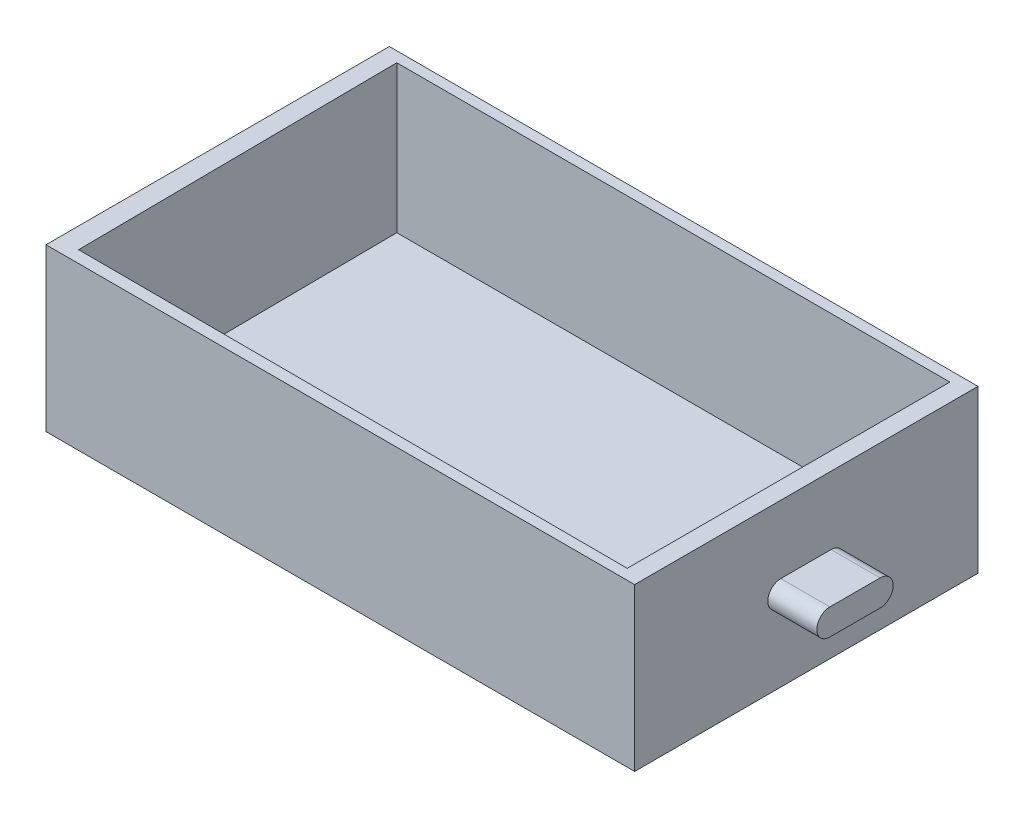
ISO-10303-21;
HEADER;
FILE_DESCRIPTION(('STEP AP214'),'2;1');
FILE_NAME('part.step','',(''),(''),'','','');
FILE_SCHEMA(('AUTOMOTIVE_DESIGN { 1 0 10303 214 1 1 1 1 }'));
ENDSEC;
DATA;
#1=APPLICATION_CONTEXT('core data for automotive mechanical design processes');
#2=APPLICATION_PROTOCOL_DEFINITION('international standard','automotive_design',2000,#1);
#3=PRODUCT_CONTEXT('',#1,'mechanical');
#4=PRODUCT('Part','Part','',(#3));
#5=PRODUCT_RELATED_PRODUCT_CATEGORY('part','',(#4));
#6=PRODUCT_DEFINITION_FORMATION('','',#4);
#7=PRODUCT_DEFINITION_CONTEXT('part definition',#1,'design');
#8=PRODUCT_DEFINITION('design','',#6,#7);
#9=PRODUCT_DEFINITION_SHAPE('','',#8);
#10=(LENGTH_UNIT() NAMED_UNIT(*) SI_UNIT(.MILLI.,.METRE.));
#11=(NAMED_UNIT(*) PLANE_ANGLE_UNIT() SI_UNIT($,.RADIAN.));
#12=(NAMED_UNIT(*) SI_UNIT($,.STERADIAN.) SOLID_ANGLE_UNIT());
#13=UNCERTAINTY_MEASURE_WITH_UNIT(LENGTH_MEASURE(1.E-05),#10,'distance_accuracy_value','');
#14=(GEOMETRIC_REPRESENTATION_CONTEXT(3) GLOBAL_UNCERTAINTY_ASSIGNED_CONTEXT((#13)) GLOBAL_UNIT_ASSIGNED_CONTEXT((#10,
#11,#12)) REPRESENTATION_CONTEXT('',''));
#15=CARTESIAN_POINT('',(0.,0.,0.));
#16=DIRECTION('',(0.,0.,1.));
#17=DIRECTION('',(1.,0.,0.));
#18=AXIS2_PLACEMENT_3D('',#15,#16,#17);
#19=CARTESIAN_POINT('',(60.,3.,-35.));
#20=DIRECTION('',(-1.,0.,0.));
#21=DIRECTION('',(0.,0.,1.));
#22=AXIS2_PLACEMENT_3D('',#19,#20,#21);
#23=PLANE('',#22);
#24=DIRECTION('',(0.,0.,-1.));
#25=VECTOR('',#24,1.);
#26=CARTESIAN_POINT('',(60.,0.,-35.));
#27=LINE('',#26,#25);
#28=CARTESIAN_POINT('',(60.,0.,35.));
#29=VERTEX_POINT('',#28);
#30=CARTESIAN_POINT('',(60.,0.,-35.));
#31=VERTEX_POINT('',#30);
#32=EDGE_CURVE('E222',#29,#31,#27,.T.);
#33=ORIENTED_EDGE('',*,*,#32,.T.);
#34=DIRECTION('',(0.,-1.,0.));
#35=VECTOR('',#34,1.);
#36=CARTESIAN_POINT('',(60.,3.,-35.));
#37=LINE('',#36,#35);
#38=CARTESIAN_POINT('',(60.,33.,-35.));
#39=VERTEX_POINT('',#38);
#40=EDGE_CURVE('E11',#39,#31,#37,.T.);
#41=ORIENTED_EDGE('',*,*,#40,.F.);
#42=DIRECTION('',(0.,0.,-1.));
#43=VECTOR('',#42,1.);
#44=CARTESIAN_POINT('',(60.,33.,-35.));
#45=LINE('',#44,#43);
#46=CARTESIAN_POINT('',(60.,33.,35.));
#47=VERTEX_POINT('',#46);
#48=EDGE_CURVE('E198',#47,#39,#45,.T.);
#49=ORIENTED_EDGE('',*,*,#48,.F.);
#50=DIRECTION('',(0.,-1.,0.));
#51=VECTOR('',#50,1.);
#52=CARTESIAN_POINT('',(60.,3.,35.));
#53=LINE('',#52,#51);
#54=EDGE_CURVE('E235',#47,#29,#53,.T.);
#55=ORIENTED_EDGE('',*,*,#54,.T.);
#56=EDGE_LOOP('',(#33,#41,#49,#55));
#57=FACE_BOUND('',#56,.T.);
#58=CARTESIAN_POINT('',(60.,16.5,5.19886684303352));
#59=DIRECTION('',(1.,0.,0.));
#60=DIRECTION('',(0.,0.,-1.));
#61=AXIS2_PLACEMENT_3D('',#58,#59,#60);
#62=CIRCLE('',#61,2.65988536155161);
#63=CARTESIAN_POINT('',(60.,19.1598853615516,5.19886684303352));
#64=VERTEX_POINT('',#63);
#65=CARTESIAN_POINT('',(60.,13.8401146384484,5.19886684303352));
#66=VERTEX_POINT('',#65);
#67=EDGE_CURVE('E58',#64,#66,#62,.T.);
#68=ORIENTED_EDGE('',*,*,#67,.F.);
#69=DIRECTION('',(0.,0.,1.));
#70=VECTOR('',#69,1.);
#71=CARTESIAN_POINT('',(60.,19.1598853615516,5.19886684303352));
#72=LINE('',#71,#70);
#73=CARTESIAN_POINT('',(60.,19.1598853615516,-5.03766166960611));
#74=VERTEX_POINT('',#73);
#75=EDGE_CURVE('E62',#74,#64,#72,.T.);
#76=ORIENTED_EDGE('',*,*,#75,.F.);
#77=CARTESIAN_POINT('',(60.,16.5,-5.03766166960611));
#78=DIRECTION('',(1.,0.,0.));
#79=DIRECTION('',(0.,0.,-1.));
#80=AXIS2_PLACEMENT_3D('',#77,#78,#79);
#81=CIRCLE('',#80,2.65988536155161);
#82=CARTESIAN_POINT('',(60.,13.8401146384484,-5.03766166960611));
#83=VERTEX_POINT('',#82);
#84=EDGE_CURVE('E451',#83,#74,#81,.T.);
#85=ORIENTED_EDGE('',*,*,#84,.F.);
#86=DIRECTION('',(0.,0.,-1.));
#87=VECTOR('',#86,1.);
#88=CARTESIAN_POINT('',(60.,13.8401146384484,5.19886684303352));
#89=LINE('',#88,#87);
#90=EDGE_CURVE('E461',#66,#83,#89,.T.);
#91=ORIENTED_EDGE('',*,*,#90,.F.);
#92=EDGE_LOOP('',(#68,#76,#85,#91));
#93=FACE_BOUND('',#92,.T.);
#94=ADVANCED_FACE('F43',(#57,#93),#23,.F.);
#95=CARTESIAN_POINT('',(-60.,3.,-35.));
#96=DIRECTION('',(0.,0.,1.));
#97=DIRECTION('',(1.,0.,0.));
#98=AXIS2_PLACEMENT_3D('',#95,#96,#97);
#99=PLANE('',#98);
#100=DIRECTION('',(-1.,0.,0.));
#101=VECTOR('',#100,1.);
#102=CARTESIAN_POINT('',(-60.,0.,-35.));
#103=LINE('',#102,#101);
#104=CARTESIAN_POINT('',(-60.,0.,-35.));
#105=VERTEX_POINT('',#104);
#106=EDGE_CURVE('E226',#31,#105,#103,.T.);
#107=ORIENTED_EDGE('',*,*,#106,.T.);
#108=DIRECTION('',(0.,-1.,0.));
#109=VECTOR('',#108,1.);
#110=CARTESIAN_POINT('',(-60.,3.,-35.));
#111=LINE('',#110,#109);
#112=CARTESIAN_POINT('',(-60.,33.,-35.));
#113=VERTEX_POINT('',#112);
#114=EDGE_CURVE('E51',#113,#105,#111,.T.);
#115=ORIENTED_EDGE('',*,*,#114,.F.);
#116=DIRECTION('',(-1.,0.,0.));
#117=VECTOR('',#116,1.);
#118=CARTESIAN_POINT('',(-60.,33.,-35.));
#119=LINE('',#118,#117);
#120=EDGE_CURVE('E202',#39,#113,#119,.T.);
#121=ORIENTED_EDGE('',*,*,#120,.F.);
#122=ORIENTED_EDGE('',*,*,#40,.T.);
#123=EDGE_LOOP('',(#107,#115,#121,#122));
#124=FACE_BOUND('',#123,.T.);
#125=ADVANCED_FACE('F262',(#124),#99,.F.);
#126=CARTESIAN_POINT('',(-60.,3.,-35.));
#127=DIRECTION('',(1.,0.,0.));
#128=DIRECTION('',(0.,0.,-1.));
#129=AXIS2_PLACEMENT_3D('',#126,#127,#128);
#130=PLANE('',#129);
#131=DIRECTION('',(0.,0.,1.));
#132=VECTOR('',#131,1.);
#133=CARTESIAN_POINT('',(-60.,0.,-35.));
#134=LINE('',#133,#132);
#135=CARTESIAN_POINT('',(-60.,0.,35.));
#136=VERTEX_POINT('',#135);
#137=EDGE_CURVE('E229',#105,#136,#134,.T.);
#138=ORIENTED_EDGE('',*,*,#137,.T.);
#139=DIRECTION('',(0.,-1.,0.));
#140=VECTOR('',#139,1.);
#141=CARTESIAN_POINT('',(-60.,3.,35.));
#142=LINE('',#141,#140);
#143=CARTESIAN_POINT('',(-60.,33.,35.));
#144=VERTEX_POINT('',#143);
#145=EDGE_CURVE('E239',#144,#136,#142,.T.);
#146=ORIENTED_EDGE('',*,*,#145,.F.);
#147=DIRECTION('',(0.,0.,1.));
#148=VECTOR('',#147,1.);
#149=CARTESIAN_POINT('',(-60.,33.,35.));
#150=LINE('',#149,#148);
#151=EDGE_CURVE('E190',#113,#144,#150,.T.);
#152=ORIENTED_EDGE('',*,*,#151,.F.);
#153=ORIENTED_EDGE('',*,*,#114,.T.);
#154=EDGE_LOOP('',(#138,#146,#152,#153));
#155=FACE_BOUND('',#154,.T.);
#156=ADVANCED_FACE('F247',(#155),#130,.F.);
#157=CARTESIAN_POINT('',(-60.,3.,35.));
#158=DIRECTION('',(0.,0.,-1.));
#159=DIRECTION('',(-1.,0.,0.));
#160=AXIS2_PLACEMENT_3D('',#157,#158,#159);
#161=PLANE('',#160);
#162=DIRECTION('',(1.,0.,0.));
#163=VECTOR('',#162,1.);
#164=CARTESIAN_POINT('',(-60.,0.,35.));
#165=LINE('',#164,#163);
#166=EDGE_CURVE('E232',#136,#29,#165,.T.);
#167=ORIENTED_EDGE('',*,*,#166,.T.);
#168=ORIENTED_EDGE('',*,*,#54,.F.);
#169=DIRECTION('',(1.,0.,0.));
#170=VECTOR('',#169,1.);
#171=CARTESIAN_POINT('',(60.,33.,35.));
#172=LINE('',#171,#170);
#173=EDGE_CURVE('E194',#144,#47,#172,.T.);
#174=ORIENTED_EDGE('',*,*,#173,.F.);
#175=ORIENTED_EDGE('',*,*,#145,.T.);
#176=EDGE_LOOP('',(#167,#168,#174,#175));
#177=FACE_BOUND('',#176,.T.);
#178=ADVANCED_FACE('F255',(#177),#161,.F.);
#179=CARTESIAN_POINT('',(0.,0.,0.));
#180=DIRECTION('',(0.,1.,0.));
#181=DIRECTION('',(0.,0.,1.));
#182=AXIS2_PLACEMENT_3D('',#179,#180,#181);
#183=PLANE('',#182);
#184=ORIENTED_EDGE('',*,*,#32,.F.);
#185=ORIENTED_EDGE('',*,*,#166,.F.);
#186=ORIENTED_EDGE('',*,*,#137,.F.);
#187=ORIENTED_EDGE('',*,*,#106,.F.);
#188=EDGE_LOOP('',(#184,#185,#186,#187));
#189=FACE_BOUND('',#188,.T.);
#190=ADVANCED_FACE('F253',(#189),#183,.F.);
#191=CARTESIAN_POINT('',(0.,33.,0.));
#192=DIRECTION('',(0.,-1.,0.));
#193=DIRECTION('',(0.,0.,-1.));
#194=AXIS2_PLACEMENT_3D('',#191,#192,#193);
#195=PLANE('',#194);
#196=ORIENTED_EDGE('',*,*,#151,.T.);
#197=ORIENTED_EDGE('',*,*,#173,.T.);
#198=ORIENTED_EDGE('',*,*,#48,.T.);
#199=ORIENTED_EDGE('',*,*,#120,.T.);
#200=EDGE_LOOP('',(#196,#197,#198,#199));
#201=FACE_BOUND('',#200,.T.);
#202=DIRECTION('',(0.00874329868267045,0.,0.99996177663356));
#203=VECTOR('',#202,1.);
#204=CARTESIAN_POINT('',(-55.8,33.,32.55));
#205=LINE('',#204,#203);
#206=CARTESIAN_POINT('',(-56.3721286162266,33.,-32.8837416927988));
#207=VERTEX_POINT('',#206);
#208=CARTESIAN_POINT('',(-55.8,33.,32.55));
#209=VERTEX_POINT('',#208);
#210=EDGE_CURVE('E155',#207,#209,#205,.T.);
#211=ORIENTED_EDGE('',*,*,#210,.F.);
#212=DIRECTION('',(-1.,0.,0.));
#213=VECTOR('',#212,1.);
#214=CARTESIAN_POINT('',(-56.3721286162266,33.,-32.8837416927988));
#215=LINE('',#214,#213);
#216=CARTESIAN_POINT('',(56.3721286162266,33.,-32.8837416927988));
#217=VERTEX_POINT('',#216);
#218=EDGE_CURVE('E171',#217,#207,#215,.T.);
#219=ORIENTED_EDGE('',*,*,#218,.F.);
#220=DIRECTION('',(0.,0.,-1.));
#221=VECTOR('',#220,1.);
#222=CARTESIAN_POINT('',(56.3721286162266,33.,-32.8837416927988));
#223=LINE('',#222,#221);
#224=CARTESIAN_POINT('',(56.3721286162266,33.,32.8837416927988));
#225=VERTEX_POINT('',#224);
#226=EDGE_CURVE('E167',#225,#217,#223,.T.);
#227=ORIENTED_EDGE('',*,*,#226,.F.);
#228=DIRECTION('',(0.999995573931537,0.,0.00297525080206931));
#229=VECTOR('',#228,1.);
#230=CARTESIAN_POINT('',(56.3721286162266,33.,32.8837416927988));
#231=LINE('',#230,#229);
#232=EDGE_CURVE('E159',#209,#225,#231,.T.);
#233=ORIENTED_EDGE('',*,*,#232,.F.);
#234=EDGE_LOOP('',(#211,#219,#227,#233));
#235=FACE_BOUND('',#234,.T.);
#236=ADVANCED_FACE('F260',(#201,#235),#195,.F.);
#237=CARTESIAN_POINT('',(-55.8,33.,32.55));
#238=DIRECTION('',(0.99996177663356,0.,-0.00874329868267045));
#239=DIRECTION('',(-0.00874329868267045,0.,-0.99996177663356));
#240=AXIS2_PLACEMENT_3D('',#237,#238,#239);
#241=PLANE('',#240);
#242=DIRECTION('',(0.,-1.,0.));
#243=VECTOR('',#242,1.);
#244=CARTESIAN_POINT('',(-55.8,33.,32.55));
#245=LINE('',#244,#243);
#246=CARTESIAN_POINT('',(-55.8,3.,32.55));
#247=VERTEX_POINT('',#246);
#248=EDGE_CURVE('E186',#209,#247,#245,.T.);
#249=ORIENTED_EDGE('',*,*,#248,.T.);
#250=DIRECTION('',(-0.00874329868267045,0.,-0.99996177663356));
#251=VECTOR('',#250,1.);
#252=CARTESIAN_POINT('',(-56.0803178477965,3.,0.490345711826204));
#253=LINE('',#252,#251);
#254=CARTESIAN_POINT('',(-56.3721286162266,3.,-32.8837416927988));
#255=VERTEX_POINT('',#254);
#256=EDGE_CURVE('E218',#247,#255,#253,.T.);
#257=ORIENTED_EDGE('',*,*,#256,.T.);
#258=DIRECTION('',(0.,-1.,0.));
#259=VECTOR('',#258,1.);
#260=CARTESIAN_POINT('',(-56.3721286162266,33.,-32.8837416927988));
#261=LINE('',#260,#259);
#262=EDGE_CURVE('E174',#207,#255,#261,.T.);
#263=ORIENTED_EDGE('',*,*,#262,.F.);
#264=ORIENTED_EDGE('',*,*,#210,.T.);
#265=EDGE_LOOP('',(#249,#257,#263,#264));
#266=FACE_BOUND('',#265,.T.);
#267=ADVANCED_FACE('F281',(#266),#241,.T.);
#268=CARTESIAN_POINT('',(56.3721286162266,33.,32.8837416927988));
#269=DIRECTION('',(0.00297525080206931,0.,-0.999995573931537));
#270=DIRECTION('',(-0.999995573931537,0.,-0.00297525080206931));
#271=AXIS2_PLACEMENT_3D('',#268,#269,#270);
#272=PLANE('',#271);
#273=DIRECTION('',(0.,-1.,0.));
#274=VECTOR('',#273,1.);
#275=CARTESIAN_POINT('',(56.3721286162266,33.,32.8837416927988));
#276=LINE('',#275,#274);
#277=CARTESIAN_POINT('',(56.3721286162266,3.,32.8837416927988));
#278=VERTEX_POINT('',#277);
#279=EDGE_CURVE('E182',#225,#278,#276,.T.);
#280=ORIENTED_EDGE('',*,*,#279,.T.);
#281=DIRECTION('',(-0.999995573931537,0.,-0.00297525080206931));
#282=VECTOR('',#281,1.);
#283=CARTESIAN_POINT('',(-0.0973379331146561,3.,32.7157301235248));
#284=LINE('',#283,#282);
#285=EDGE_CURVE('E214',#278,#247,#284,.T.);
#286=ORIENTED_EDGE('',*,*,#285,.T.);
#287=ORIENTED_EDGE('',*,*,#248,.F.);
#288=ORIENTED_EDGE('',*,*,#232,.T.);
#289=EDGE_LOOP('',(#280,#286,#287,#288));
#290=FACE_BOUND('',#289,.T.);
#291=ADVANCED_FACE('F284',(#290),#272,.T.);
#292=CARTESIAN_POINT('',(56.3721286162266,33.,-32.8837416927988));
#293=DIRECTION('',(-1.,0.,0.));
#294=DIRECTION('',(0.,0.,1.));
#295=AXIS2_PLACEMENT_3D('',#292,#293,#294);
#296=PLANE('',#295);
#297=DIRECTION('',(0.,-1.,0.));
#298=VECTOR('',#297,1.);
#299=CARTESIAN_POINT('',(56.3721286162266,33.,-32.8837416927988));
#300=LINE('',#299,#298);
#301=CARTESIAN_POINT('',(56.3721286162266,3.,-32.8837416927988));
#302=VERTEX_POINT('',#301);
#303=EDGE_CURVE('E178',#217,#302,#300,.T.);
#304=ORIENTED_EDGE('',*,*,#303,.T.);
#305=DIRECTION('',(0.,0.,1.));
#306=VECTOR('',#305,1.);
#307=CARTESIAN_POINT('',(56.3721286162266,3.,0.));
#308=LINE('',#307,#306);
#309=EDGE_CURVE('E210',#302,#278,#308,.T.);
#310=ORIENTED_EDGE('',*,*,#309,.T.);
#311=ORIENTED_EDGE('',*,*,#279,.F.);
#312=ORIENTED_EDGE('',*,*,#226,.T.);
#313=EDGE_LOOP('',(#304,#310,#311,#312));
#314=FACE_BOUND('',#313,.T.);
#315=ADVANCED_FACE('F288',(#314),#296,.T.);
#316=CARTESIAN_POINT('',(-56.3721286162266,33.,-32.8837416927988));
#317=DIRECTION('',(0.,0.,1.));
#318=DIRECTION('',(1.,0.,0.));
#319=AXIS2_PLACEMENT_3D('',#316,#317,#318);
#320=PLANE('',#319);
#321=ORIENTED_EDGE('',*,*,#262,.T.);
#322=DIRECTION('',(1.,0.,0.));
#323=VECTOR('',#322,1.);
#324=CARTESIAN_POINT('',(0.,3.,-32.8837416927988));
#325=LINE('',#324,#323);
#326=EDGE_CURVE('E206',#255,#302,#325,.T.);
#327=ORIENTED_EDGE('',*,*,#326,.T.);
#328=ORIENTED_EDGE('',*,*,#303,.F.);
#329=ORIENTED_EDGE('',*,*,#218,.T.);
#330=EDGE_LOOP('',(#321,#327,#328,#329));
#331=FACE_BOUND('',#330,.T.);
#332=ADVANCED_FACE('F277',(#331),#320,.T.);
#333=CARTESIAN_POINT('',(0.,3.,0.));
#334=DIRECTION('',(0.,1.,0.));
#335=DIRECTION('',(0.,0.,1.));
#336=AXIS2_PLACEMENT_3D('',#333,#334,#335);
#337=PLANE('',#336);
#338=ORIENTED_EDGE('',*,*,#256,.F.);
#339=ORIENTED_EDGE('',*,*,#285,.F.);
#340=ORIENTED_EDGE('',*,*,#309,.F.);
#341=ORIENTED_EDGE('',*,*,#326,.F.);
#342=EDGE_LOOP('',(#338,#339,#340,#341));
#343=FACE_BOUND('',#342,.T.);
#344=ADVANCED_FACE('F274',(#343),#337,.T.);
#345=CARTESIAN_POINT('',(70.,16.5,5.19886684303352));
#346=DIRECTION('',(-1.,0.,0.));
#347=DIRECTION('',(0.,0.,1.));
#348=AXIS2_PLACEMENT_3D('',#345,#346,#347);
#349=CYLINDRICAL_SURFACE('',#348,2.65988536155161);
#350=ORIENTED_EDGE('',*,*,#67,.T.);
#351=DIRECTION('',(-1.,0.,0.));
#352=VECTOR('',#351,1.);
#353=CARTESIAN_POINT('',(70.,13.8401146384484,5.19886684303352));
#354=LINE('',#353,#352);
#355=CARTESIAN_POINT('',(70.,13.8401146384484,5.19886684303352));
#356=VERTEX_POINT('',#355);
#357=EDGE_CURVE('E135',#356,#66,#354,.T.);
#358=ORIENTED_EDGE('',*,*,#357,.F.);
#359=CARTESIAN_POINT('',(70.,16.5,5.19886684303352));
#360=DIRECTION('',(1.,0.,0.));
#361=DIRECTION('',(0.,0.,-1.));
#362=AXIS2_PLACEMENT_3D('',#359,#360,#361);
#363=CIRCLE('',#362,2.65988536155161);
#364=CARTESIAN_POINT('',(70.,19.1598853615516,5.19886684303352));
#365=VERTEX_POINT('',#364);
#366=EDGE_CURVE('E142',#365,#356,#363,.T.);
#367=ORIENTED_EDGE('',*,*,#366,.F.);
#368=DIRECTION('',(-1.,0.,0.));
#369=VECTOR('',#368,1.);
#370=CARTESIAN_POINT('',(70.,19.1598853615516,5.19886684303352));
#371=LINE('',#370,#369);
#372=EDGE_CURVE('E448',#365,#64,#371,.T.);
#373=ORIENTED_EDGE('',*,*,#372,.T.);
#374=EDGE_LOOP('',(#350,#358,#367,#373));
#375=FACE_BOUND('',#374,.T.);
#376=ADVANCED_FACE('F153',(#375),#349,.T.);
#377=CARTESIAN_POINT('',(70.,13.8401146384484,5.19886684303352));
#378=DIRECTION('',(0.,1.,0.));
#379=DIRECTION('',(0.,0.,1.));
#380=AXIS2_PLACEMENT_3D('',#377,#378,#379);
#381=PLANE('',#380);
#382=ORIENTED_EDGE('',*,*,#90,.T.);
#383=DIRECTION('',(-1.,0.,0.));
#384=VECTOR('',#383,1.);
#385=CARTESIAN_POINT('',(70.,13.8401146384484,-5.03766166960611));
#386=LINE('',#385,#384);
#387=CARTESIAN_POINT('',(70.,13.8401146384484,-5.03766166960611));
#388=VERTEX_POINT('',#387);
#389=EDGE_CURVE('E137',#388,#83,#386,.T.);
#390=ORIENTED_EDGE('',*,*,#389,.F.);
#391=DIRECTION('',(0.,0.,-1.));
#392=VECTOR('',#391,1.);
#393=CARTESIAN_POINT('',(70.,13.8401146384484,5.19886684303352));
#394=LINE('',#393,#392);
#395=EDGE_CURVE('E130',#356,#388,#394,.T.);
#396=ORIENTED_EDGE('',*,*,#395,.F.);
#397=ORIENTED_EDGE('',*,*,#357,.T.);
#398=EDGE_LOOP('',(#382,#390,#396,#397));
#399=FACE_BOUND('',#398,.T.);
#400=ADVANCED_FACE('F133',(#399),#381,.F.);
#401=CARTESIAN_POINT('',(70.,16.5,-5.03766166960611));
#402=DIRECTION('',(-1.,0.,0.));
#403=DIRECTION('',(0.,0.,1.));
#404=AXIS2_PLACEMENT_3D('',#401,#402,#403);
#405=CYLINDRICAL_SURFACE('',#404,2.65988536155161);
#406=ORIENTED_EDGE('',*,*,#84,.T.);
#407=DIRECTION('',(-1.,0.,0.));
#408=VECTOR('',#407,1.);
#409=CARTESIAN_POINT('',(70.,19.1598853615516,-5.03766166960611));
#410=LINE('',#409,#408);
#411=CARTESIAN_POINT('',(70.,19.1598853615516,-5.03766166960611));
#412=VERTEX_POINT('',#411);
#413=EDGE_CURVE('E161',#412,#74,#410,.T.);
#414=ORIENTED_EDGE('',*,*,#413,.F.);
#415=CARTESIAN_POINT('',(70.,16.5,-5.03766166960611));
#416=DIRECTION('',(1.,0.,0.));
#417=DIRECTION('',(0.,0.,-1.));
#418=AXIS2_PLACEMENT_3D('',#415,#416,#417);
#419=CIRCLE('',#418,2.65988536155161);
#420=EDGE_CURVE('E141',#388,#412,#419,.T.);
#421=ORIENTED_EDGE('',*,*,#420,.F.);
#422=ORIENTED_EDGE('',*,*,#389,.T.);
#423=EDGE_LOOP('',(#406,#414,#421,#422));
#424=FACE_BOUND('',#423,.T.);
#425=ADVANCED_FACE('F300',(#424),#405,.T.);
#426=CARTESIAN_POINT('',(70.,19.1598853615516,5.19886684303352));
#427=DIRECTION('',(0.,-1.,0.));
#428=DIRECTION('',(0.,0.,-1.));
#429=AXIS2_PLACEMENT_3D('',#426,#427,#428);
#430=PLANE('',#429);
#431=ORIENTED_EDGE('',*,*,#75,.T.);
#432=ORIENTED_EDGE('',*,*,#372,.F.);
#433=DIRECTION('',(0.,0.,1.));
#434=VECTOR('',#433,1.);
#435=CARTESIAN_POINT('',(70.,19.1598853615516,5.19886684303352));
#436=LINE('',#435,#434);
#437=EDGE_CURVE('E147',#412,#365,#436,.T.);
#438=ORIENTED_EDGE('',*,*,#437,.F.);
#439=ORIENTED_EDGE('',*,*,#413,.T.);
#440=EDGE_LOOP('',(#431,#432,#438,#439));
#441=FACE_BOUND('',#440,.T.);
#442=ADVANCED_FACE('F303',(#441),#430,.F.);
#443=CARTESIAN_POINT('',(70.,16.5,5.19886684303352));
#444=DIRECTION('',(1.,0.,0.));
#445=DIRECTION('',(0.,0.,-1.));
#446=AXIS2_PLACEMENT_3D('',#443,#444,#445);
#447=PLANE('',#446);
#448=ORIENTED_EDGE('',*,*,#366,.T.);
#449=ORIENTED_EDGE('',*,*,#395,.T.);
#450=ORIENTED_EDGE('',*,*,#420,.T.);
#451=ORIENTED_EDGE('',*,*,#437,.T.);
#452=EDGE_LOOP('',(#448,#449,#450,#451));
#453=FACE_BOUND('',#452,.T.);
#454=ADVANCED_FACE('F145',(#453),#447,.T.);
#455=CLOSED_SHELL('',(#94,#125,#156,#178,#190,#236,#267,#291,#315,#332,#344,#376,#400,#425,#442,#454));
#456=MANIFOLD_SOLID_BREP('B2',#455);
#457=ADVANCED_BREP_SHAPE_REPRESENTATION('',(#18,#456),#14);
#458=SHAPE_DEFINITION_REPRESENTATION(#9,#457);
ENDSEC;
END-ISO-10303-21;
